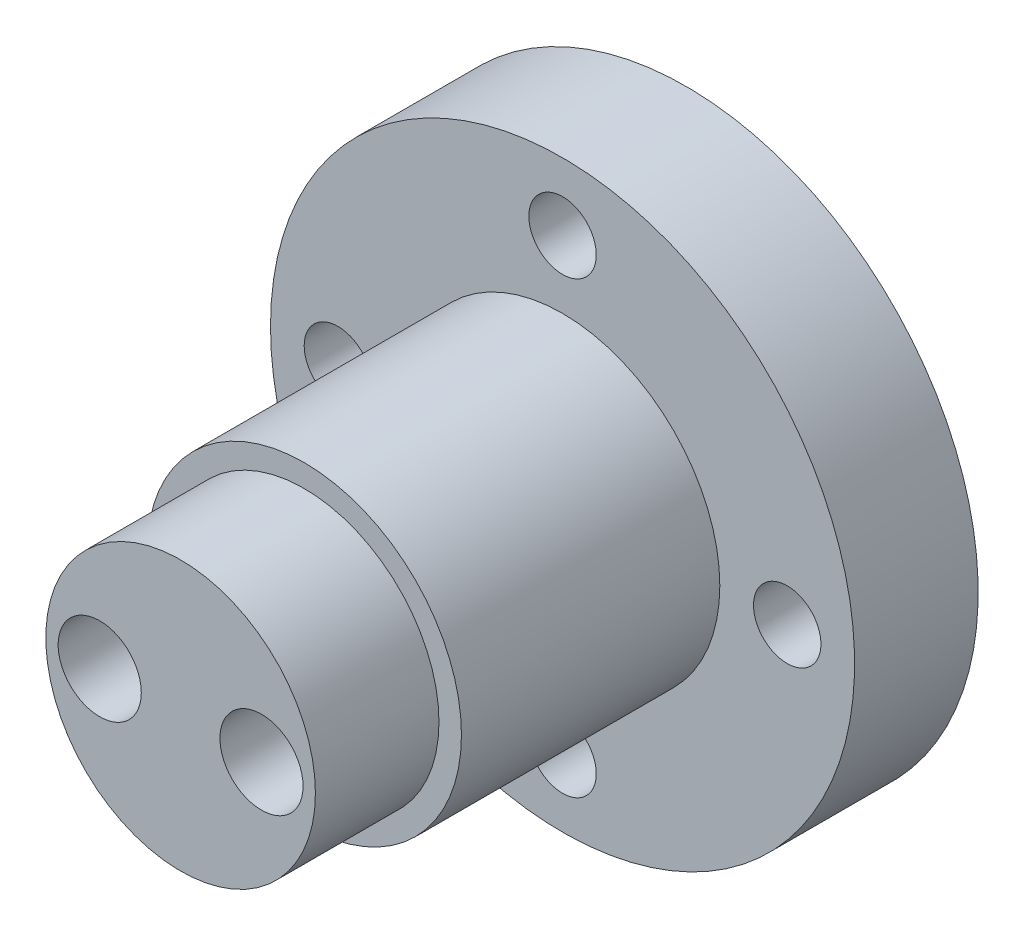
ISO-10303-21;
HEADER;
FILE_DESCRIPTION(('STEP AP214'),'2;1');
FILE_NAME('part.step','',(''),(''),'','','');
FILE_SCHEMA(('AUTOMOTIVE_DESIGN { 1 0 10303 214 1 1 1 1 }'));
ENDSEC;
DATA;
#1=APPLICATION_CONTEXT('core data for automotive mechanical design processes');
#2=APPLICATION_PROTOCOL_DEFINITION('international standard','automotive_design',2000,#1);
#3=PRODUCT_CONTEXT('',#1,'mechanical');
#4=PRODUCT('Part','Part','',(#3));
#5=PRODUCT_RELATED_PRODUCT_CATEGORY('part','',(#4));
#6=PRODUCT_DEFINITION_FORMATION('','',#4);
#7=PRODUCT_DEFINITION_CONTEXT('part definition',#1,'design');
#8=PRODUCT_DEFINITION('design','',#6,#7);
#9=PRODUCT_DEFINITION_SHAPE('','',#8);
#10=(LENGTH_UNIT() NAMED_UNIT(*) SI_UNIT(.MILLI.,.METRE.));
#11=(NAMED_UNIT(*) PLANE_ANGLE_UNIT() SI_UNIT($,.RADIAN.));
#12=(NAMED_UNIT(*) SI_UNIT($,.STERADIAN.) SOLID_ANGLE_UNIT());
#13=UNCERTAINTY_MEASURE_WITH_UNIT(LENGTH_MEASURE(1.E-05),#10,'distance_accuracy_value','');
#14=(GEOMETRIC_REPRESENTATION_CONTEXT(3) GLOBAL_UNCERTAINTY_ASSIGNED_CONTEXT((#13)) GLOBAL_UNIT_ASSIGNED_CONTEXT((#10,
#11,#12)) REPRESENTATION_CONTEXT('',''));
#15=CARTESIAN_POINT('',(0.,0.,0.));
#16=DIRECTION('',(0.,0.,1.));
#17=DIRECTION('',(1.,0.,0.));
#18=AXIS2_PLACEMENT_3D('',#15,#16,#17);
#19=CARTESIAN_POINT('',(0.,0.,11.5));
#20=DIRECTION('',(0.,0.,-1.));
#21=DIRECTION('',(-1.,0.,0.));
#22=AXIS2_PLACEMENT_3D('',#19,#20,#21);
#23=CYLINDRICAL_SURFACE('',#22,7.);
#24=CARTESIAN_POINT('',(0.,0.,11.5));
#25=DIRECTION('',(0.,0.,1.));
#26=DIRECTION('',(1.,0.,0.));
#27=AXIS2_PLACEMENT_3D('',#24,#25,#26);
#28=CIRCLE('',#27,7.);
#29=CARTESIAN_POINT('',(7.,0.,11.5));
#30=VERTEX_POINT('',#29);
#31=EDGE_CURVE('E37',#30,#30,#28,.T.);
#32=ORIENTED_EDGE('',*,*,#31,.F.);
#33=EDGE_LOOP('',(#32));
#34=FACE_BOUND('',#33,.T.);
#35=CARTESIAN_POINT('',(0.,0.,0.));
#36=DIRECTION('',(0.,0.,1.));
#37=DIRECTION('',(1.,0.,0.));
#38=AXIS2_PLACEMENT_3D('',#35,#36,#37);
#39=CIRCLE('',#38,7.);
#40=CARTESIAN_POINT('',(7.,0.,0.));
#41=VERTEX_POINT('',#40);
#42=EDGE_CURVE('E33',#41,#41,#39,.T.);
#43=ORIENTED_EDGE('',*,*,#42,.T.);
#44=EDGE_LOOP('',(#43));
#45=FACE_BOUND('',#44,.T.);
#46=ADVANCED_FACE('F30',(#34,#45),#23,.T.);
#47=CARTESIAN_POINT('',(0.,0.,11.5));
#48=DIRECTION('',(0.,0.,1.));
#49=DIRECTION('',(1.,0.,0.));
#50=AXIS2_PLACEMENT_3D('',#47,#48,#49);
#51=PLANE('',#50);
#52=CARTESIAN_POINT('',(0.,0.,11.5));
#53=DIRECTION('',(0.,0.,1.));
#54=DIRECTION('',(1.,0.,0.));
#55=AXIS2_PLACEMENT_3D('',#52,#53,#54);
#56=CIRCLE('',#55,6.);
#57=CARTESIAN_POINT('',(6.,0.,11.5));
#58=VERTEX_POINT('',#57);
#59=EDGE_CURVE('E10',#58,#58,#56,.T.);
#60=ORIENTED_EDGE('',*,*,#59,.F.);
#61=EDGE_LOOP('',(#60));
#62=FACE_BOUND('',#61,.T.);
#63=ORIENTED_EDGE('',*,*,#31,.T.);
#64=EDGE_LOOP('',(#63));
#65=FACE_BOUND('',#64,.T.);
#66=ADVANCED_FACE('F109',(#62,#65),#51,.T.);
#67=CARTESIAN_POINT('',(0.,0.,17.));
#68=DIRECTION('',(0.,0.,-1.));
#69=DIRECTION('',(-1.,0.,0.));
#70=AXIS2_PLACEMENT_3D('',#67,#68,#69);
#71=CYLINDRICAL_SURFACE('',#70,6.);
#72=CARTESIAN_POINT('',(0.,0.,17.));
#73=DIRECTION('',(0.,0.,1.));
#74=DIRECTION('',(1.,0.,0.));
#75=AXIS2_PLACEMENT_3D('',#72,#73,#74);
#76=CIRCLE('',#75,6.);
#77=CARTESIAN_POINT('',(6.,0.,17.));
#78=VERTEX_POINT('',#77);
#79=EDGE_CURVE('E42',#78,#78,#76,.T.);
#80=ORIENTED_EDGE('',*,*,#79,.F.);
#81=EDGE_LOOP('',(#80));
#82=FACE_BOUND('',#81,.T.);
#83=ORIENTED_EDGE('',*,*,#59,.T.);
#84=EDGE_LOOP('',(#83));
#85=FACE_BOUND('',#84,.T.);
#86=ADVANCED_FACE('F102',(#82,#85),#71,.T.);
#87=CARTESIAN_POINT('',(0.,0.,17.));
#88=DIRECTION('',(0.,0.,1.));
#89=DIRECTION('',(1.,0.,0.));
#90=AXIS2_PLACEMENT_3D('',#87,#88,#89);
#91=PLANE('',#90);
#92=CARTESIAN_POINT('',(3.6,-3.04023440482249E-07,17.));
#93=DIRECTION('',(0.,0.,1.));
#94=DIRECTION('',(1.,0.,0.));
#95=AXIS2_PLACEMENT_3D('',#92,#93,#94);
#96=CIRCLE('',#95,1.85);
#97=CARTESIAN_POINT('',(5.45,-3.04023440482249E-07,17.));
#98=VERTEX_POINT('',#97);
#99=EDGE_CURVE('E83',#98,#98,#96,.T.);
#100=ORIENTED_EDGE('',*,*,#99,.F.);
#101=EDGE_LOOP('',(#100));
#102=FACE_BOUND('',#101,.T.);
#103=CARTESIAN_POINT('',(-3.6,0.,17.));
#104=DIRECTION('',(0.,0.,1.));
#105=DIRECTION('',(1.,0.,0.));
#106=AXIS2_PLACEMENT_3D('',#103,#104,#105);
#107=CIRCLE('',#106,1.85);
#108=CARTESIAN_POINT('',(-1.75,0.,17.));
#109=VERTEX_POINT('',#108);
#110=EDGE_CURVE('E77',#109,#109,#107,.T.);
#111=ORIENTED_EDGE('',*,*,#110,.F.);
#112=EDGE_LOOP('',(#111));
#113=FACE_BOUND('',#112,.T.);
#114=ORIENTED_EDGE('',*,*,#79,.T.);
#115=EDGE_LOOP('',(#114));
#116=FACE_BOUND('',#115,.T.);
#117=ADVANCED_FACE('F99',(#102,#113,#116),#91,.T.);
#118=CARTESIAN_POINT('',(0.,0.,-5.5));
#119=DIRECTION('',(0.,0.,-1.));
#120=DIRECTION('',(-1.,0.,0.));
#121=AXIS2_PLACEMENT_3D('',#118,#119,#120);
#122=PLANE('',#121);
#123=CARTESIAN_POINT('',(3.6,-3.04023440482249E-07,-5.5));
#124=DIRECTION('',(0.,0.,1.));
#125=DIRECTION('',(1.,0.,0.));
#126=AXIS2_PLACEMENT_3D('',#123,#124,#125);
#127=CIRCLE('',#126,1.85);
#128=CARTESIAN_POINT('',(5.45,-3.04023440482249E-07,-5.5));
#129=VERTEX_POINT('',#128);
#130=EDGE_CURVE('E74',#129,#129,#127,.T.);
#131=ORIENTED_EDGE('',*,*,#130,.T.);
#132=EDGE_LOOP('',(#131));
#133=FACE_BOUND('',#132,.T.);
#134=CARTESIAN_POINT('',(-3.6,0.,-5.5));
#135=DIRECTION('',(0.,0.,1.));
#136=DIRECTION('',(1.,0.,0.));
#137=AXIS2_PLACEMENT_3D('',#134,#135,#136);
#138=CIRCLE('',#137,1.85);
#139=CARTESIAN_POINT('',(-1.75,0.,-5.5));
#140=VERTEX_POINT('',#139);
#141=EDGE_CURVE('E80',#140,#140,#138,.T.);
#142=ORIENTED_EDGE('',*,*,#141,.T.);
#143=EDGE_LOOP('',(#142));
#144=FACE_BOUND('',#143,.T.);
#145=CARTESIAN_POINT('',(10.,0.,-5.5));
#146=DIRECTION('',(0.,0.,-1.));
#147=DIRECTION('',(-1.,0.,0.));
#148=AXIS2_PLACEMENT_3D('',#145,#146,#147);
#149=CIRCLE('',#148,1.5);
#150=CARTESIAN_POINT('',(8.5,0.,-5.5));
#151=VERTEX_POINT('',#150);
#152=EDGE_CURVE('E62',#151,#151,#149,.T.);
#153=ORIENTED_EDGE('',*,*,#152,.F.);
#154=EDGE_LOOP('',(#153));
#155=FACE_BOUND('',#154,.T.);
#156=CARTESIAN_POINT('',(-10.,0.,-5.5));
#157=DIRECTION('',(0.,0.,-1.));
#158=DIRECTION('',(-1.,0.,0.));
#159=AXIS2_PLACEMENT_3D('',#156,#157,#158);
#160=CIRCLE('',#159,1.5);
#161=CARTESIAN_POINT('',(-11.5,0.,-5.5));
#162=VERTEX_POINT('',#161);
#163=EDGE_CURVE('E50',#162,#162,#160,.T.);
#164=ORIENTED_EDGE('',*,*,#163,.F.);
#165=EDGE_LOOP('',(#164));
#166=FACE_BOUND('',#165,.T.);
#167=CARTESIAN_POINT('',(0.,0.,-5.5));
#168=DIRECTION('',(0.,0.,-1.));
#169=DIRECTION('',(-1.,0.,0.));
#170=AXIS2_PLACEMENT_3D('',#167,#168,#169);
#171=CIRCLE('',#170,13.);
#172=CARTESIAN_POINT('',(-13.,0.,-5.5));
#173=VERTEX_POINT('',#172);
#174=EDGE_CURVE('E49',#173,#173,#171,.T.);
#175=ORIENTED_EDGE('',*,*,#174,.T.);
#176=EDGE_LOOP('',(#175));
#177=FACE_BOUND('',#176,.T.);
#178=CARTESIAN_POINT('',(0.,-10.,-5.5));
#179=DIRECTION('',(0.,0.,-1.));
#180=DIRECTION('',(-1.,0.,0.));
#181=AXIS2_PLACEMENT_3D('',#178,#179,#180);
#182=CIRCLE('',#181,1.5);
#183=CARTESIAN_POINT('',(-1.5,-10.,-5.5));
#184=VERTEX_POINT('',#183);
#185=EDGE_CURVE('E56',#184,#184,#182,.T.);
#186=ORIENTED_EDGE('',*,*,#185,.F.);
#187=EDGE_LOOP('',(#186));
#188=FACE_BOUND('',#187,.T.);
#189=CARTESIAN_POINT('',(0.,10.,-5.5));
#190=DIRECTION('',(0.,0.,-1.));
#191=DIRECTION('',(-1.,0.,0.));
#192=AXIS2_PLACEMENT_3D('',#189,#190,#191);
#193=CIRCLE('',#192,1.5);
#194=CARTESIAN_POINT('',(-1.5,10.,-5.5));
#195=VERTEX_POINT('',#194);
#196=EDGE_CURVE('E68',#195,#195,#193,.T.);
#197=ORIENTED_EDGE('',*,*,#196,.F.);
#198=EDGE_LOOP('',(#197));
#199=FACE_BOUND('',#198,.T.);
#200=ADVANCED_FACE('F89',(#133,#144,#155,#166,#177,#188,#199),#122,.T.);
#201=CARTESIAN_POINT('',(0.,0.,0.));
#202=DIRECTION('',(0.,0.,-1.));
#203=DIRECTION('',(-1.,0.,0.));
#204=AXIS2_PLACEMENT_3D('',#201,#202,#203);
#205=PLANE('',#204);
#206=ORIENTED_EDGE('',*,*,#42,.F.);
#207=EDGE_LOOP('',(#206));
#208=FACE_BOUND('',#207,.T.);
#209=CARTESIAN_POINT('',(0.,0.,0.));
#210=DIRECTION('',(0.,0.,-1.));
#211=DIRECTION('',(-1.,0.,0.));
#212=AXIS2_PLACEMENT_3D('',#209,#210,#211);
#213=CIRCLE('',#212,13.);
#214=CARTESIAN_POINT('',(-13.,0.,0.));
#215=VERTEX_POINT('',#214);
#216=EDGE_CURVE('E46',#215,#215,#213,.T.);
#217=ORIENTED_EDGE('',*,*,#216,.F.);
#218=EDGE_LOOP('',(#217));
#219=FACE_BOUND('',#218,.T.);
#220=CARTESIAN_POINT('',(-10.,0.,0.));
#221=DIRECTION('',(0.,0.,-1.));
#222=DIRECTION('',(-1.,0.,0.));
#223=AXIS2_PLACEMENT_3D('',#220,#221,#222);
#224=CIRCLE('',#223,1.5);
#225=CARTESIAN_POINT('',(-11.5,0.,0.));
#226=VERTEX_POINT('',#225);
#227=EDGE_CURVE('E53',#226,#226,#224,.T.);
#228=ORIENTED_EDGE('',*,*,#227,.T.);
#229=EDGE_LOOP('',(#228));
#230=FACE_BOUND('',#229,.T.);
#231=CARTESIAN_POINT('',(0.,-10.,0.));
#232=DIRECTION('',(0.,0.,-1.));
#233=DIRECTION('',(-1.,0.,0.));
#234=AXIS2_PLACEMENT_3D('',#231,#232,#233);
#235=CIRCLE('',#234,1.5);
#236=CARTESIAN_POINT('',(-1.5,-10.,0.));
#237=VERTEX_POINT('',#236);
#238=EDGE_CURVE('E59',#237,#237,#235,.T.);
#239=ORIENTED_EDGE('',*,*,#238,.T.);
#240=EDGE_LOOP('',(#239));
#241=FACE_BOUND('',#240,.T.);
#242=CARTESIAN_POINT('',(10.,0.,0.));
#243=DIRECTION('',(0.,0.,-1.));
#244=DIRECTION('',(-1.,0.,0.));
#245=AXIS2_PLACEMENT_3D('',#242,#243,#244);
#246=CIRCLE('',#245,1.5);
#247=CARTESIAN_POINT('',(8.5,0.,0.));
#248=VERTEX_POINT('',#247);
#249=EDGE_CURVE('E65',#248,#248,#246,.T.);
#250=ORIENTED_EDGE('',*,*,#249,.T.);
#251=EDGE_LOOP('',(#250));
#252=FACE_BOUND('',#251,.T.);
#253=CARTESIAN_POINT('',(0.,10.,0.));
#254=DIRECTION('',(0.,0.,-1.));
#255=DIRECTION('',(-1.,0.,0.));
#256=AXIS2_PLACEMENT_3D('',#253,#254,#255);
#257=CIRCLE('',#256,1.5);
#258=CARTESIAN_POINT('',(-1.5,10.,0.));
#259=VERTEX_POINT('',#258);
#260=EDGE_CURVE('E71',#259,#259,#257,.T.);
#261=ORIENTED_EDGE('',*,*,#260,.T.);
#262=EDGE_LOOP('',(#261));
#263=FACE_BOUND('',#262,.T.);
#264=ADVANCED_FACE('F124',(#208,#219,#230,#241,#252,#263),#205,.F.);
#265=CARTESIAN_POINT('',(0.,0.,-5.5));
#266=DIRECTION('',(0.,0.,1.));
#267=DIRECTION('',(1.,0.,0.));
#268=AXIS2_PLACEMENT_3D('',#265,#266,#267);
#269=CYLINDRICAL_SURFACE('',#268,13.);
#270=ORIENTED_EDGE('',*,*,#174,.F.);
#271=EDGE_LOOP('',(#270));
#272=FACE_BOUND('',#271,.T.);
#273=ORIENTED_EDGE('',*,*,#216,.T.);
#274=EDGE_LOOP('',(#273));
#275=FACE_BOUND('',#274,.T.);
#276=ADVANCED_FACE('F127',(#272,#275),#269,.T.);
#277=CARTESIAN_POINT('',(-10.,0.,-5.5));
#278=DIRECTION('',(0.,0.,1.));
#279=DIRECTION('',(1.,0.,0.));
#280=AXIS2_PLACEMENT_3D('',#277,#278,#279);
#281=CYLINDRICAL_SURFACE('',#280,1.5);
#282=ORIENTED_EDGE('',*,*,#163,.T.);
#283=EDGE_LOOP('',(#282));
#284=FACE_BOUND('',#283,.T.);
#285=ORIENTED_EDGE('',*,*,#227,.F.);
#286=EDGE_LOOP('',(#285));
#287=FACE_BOUND('',#286,.T.);
#288=ADVANCED_FACE('F156',(#284,#287),#281,.F.);
#289=CARTESIAN_POINT('',(0.,-10.,-5.5));
#290=DIRECTION('',(0.,0.,1.));
#291=DIRECTION('',(1.,0.,0.));
#292=AXIS2_PLACEMENT_3D('',#289,#290,#291);
#293=CYLINDRICAL_SURFACE('',#292,1.5);
#294=ORIENTED_EDGE('',*,*,#185,.T.);
#295=EDGE_LOOP('',(#294));
#296=FACE_BOUND('',#295,.T.);
#297=ORIENTED_EDGE('',*,*,#238,.F.);
#298=EDGE_LOOP('',(#297));
#299=FACE_BOUND('',#298,.T.);
#300=ADVANCED_FACE('F150',(#296,#299),#293,.F.);
#301=CARTESIAN_POINT('',(10.,0.,-5.5));
#302=DIRECTION('',(0.,0.,1.));
#303=DIRECTION('',(1.,0.,0.));
#304=AXIS2_PLACEMENT_3D('',#301,#302,#303);
#305=CYLINDRICAL_SURFACE('',#304,1.5);
#306=ORIENTED_EDGE('',*,*,#152,.T.);
#307=EDGE_LOOP('',(#306));
#308=FACE_BOUND('',#307,.T.);
#309=ORIENTED_EDGE('',*,*,#249,.F.);
#310=EDGE_LOOP('',(#309));
#311=FACE_BOUND('',#310,.T.);
#312=ADVANCED_FACE('F141',(#308,#311),#305,.F.);
#313=CARTESIAN_POINT('',(0.,10.,-5.5));
#314=DIRECTION('',(0.,0.,1.));
#315=DIRECTION('',(1.,0.,0.));
#316=AXIS2_PLACEMENT_3D('',#313,#314,#315);
#317=CYLINDRICAL_SURFACE('',#316,1.5);
#318=ORIENTED_EDGE('',*,*,#196,.T.);
#319=EDGE_LOOP('',(#318));
#320=FACE_BOUND('',#319,.T.);
#321=ORIENTED_EDGE('',*,*,#260,.F.);
#322=EDGE_LOOP('',(#321));
#323=FACE_BOUND('',#322,.T.);
#324=ADVANCED_FACE('F139',(#320,#323),#317,.F.);
#325=CARTESIAN_POINT('',(-3.6,0.,-5.5));
#326=DIRECTION('',(0.,0.,1.));
#327=DIRECTION('',(1.,0.,0.));
#328=AXIS2_PLACEMENT_3D('',#325,#326,#327);
#329=CYLINDRICAL_SURFACE('',#328,1.85);
#330=CARTESIAN_POINT('',(-1.75,0.,-5.5));
#331=CARTESIAN_POINT('',(-1.75,0.,-5.265625));
#332=CARTESIAN_POINT('',(-1.75,0.,-5.03125));
#333=CARTESIAN_POINT('',(-1.75,0.,-4.5625));
#334=CARTESIAN_POINT('',(-1.75,0.,-4.328125));
#335=CARTESIAN_POINT('',(-1.75,0.,-3.859375));
#336=CARTESIAN_POINT('',(-1.75,0.,-3.625));
#337=CARTESIAN_POINT('',(-1.75,0.,-3.15625));
#338=CARTESIAN_POINT('',(-1.75,0.,-2.921875));
#339=CARTESIAN_POINT('',(-1.75,0.,-2.453125));
#340=CARTESIAN_POINT('',(-1.75,0.,-2.21875));
#341=CARTESIAN_POINT('',(-1.75,0.,-1.75));
#342=CARTESIAN_POINT('',(-1.75,0.,-1.515625));
#343=CARTESIAN_POINT('',(-1.75,0.,-1.046875));
#344=CARTESIAN_POINT('',(-1.75,0.,-0.812499999999999));
#345=CARTESIAN_POINT('',(-1.75,0.,-0.343749999999999));
#346=CARTESIAN_POINT('',(-1.75,0.,-0.109374999999999));
#347=CARTESIAN_POINT('',(-1.75,0.,0.359375000000001));
#348=CARTESIAN_POINT('',(-1.75,0.,0.593750000000001));
#349=CARTESIAN_POINT('',(-1.75,0.,1.0625));
#350=CARTESIAN_POINT('',(-1.75,0.,1.296875));
#351=CARTESIAN_POINT('',(-1.75,0.,1.765625));
#352=CARTESIAN_POINT('',(-1.75,0.,2.));
#353=CARTESIAN_POINT('',(-1.75,0.,2.46875));
#354=CARTESIAN_POINT('',(-1.75,0.,2.703125));
#355=CARTESIAN_POINT('',(-1.75,0.,3.171875));
#356=CARTESIAN_POINT('',(-1.75,0.,3.40625));
#357=CARTESIAN_POINT('',(-1.75,0.,3.875));
#358=CARTESIAN_POINT('',(-1.75,0.,4.109375));
#359=CARTESIAN_POINT('',(-1.75,0.,4.578125));
#360=CARTESIAN_POINT('',(-1.75,0.,4.8125));
#361=CARTESIAN_POINT('',(-1.75,0.,5.28125));
#362=CARTESIAN_POINT('',(-1.75,0.,5.515625));
#363=CARTESIAN_POINT('',(-1.75,0.,5.984375));
#364=CARTESIAN_POINT('',(-1.75,0.,6.21875));
#365=CARTESIAN_POINT('',(-1.75,0.,6.6875));
#366=CARTESIAN_POINT('',(-1.75,0.,6.921875));
#367=CARTESIAN_POINT('',(-1.75,0.,7.390625));
#368=CARTESIAN_POINT('',(-1.75,0.,7.625));
#369=CARTESIAN_POINT('',(-1.75,0.,8.09375));
#370=CARTESIAN_POINT('',(-1.75,0.,8.328125));
#371=CARTESIAN_POINT('',(-1.75,0.,8.796875));
#372=CARTESIAN_POINT('',(-1.75,0.,9.03125));
#373=CARTESIAN_POINT('',(-1.75,0.,9.5));
#374=CARTESIAN_POINT('',(-1.75,0.,9.734375));
#375=CARTESIAN_POINT('',(-1.75,0.,10.203125));
#376=CARTESIAN_POINT('',(-1.75,0.,10.4375));
#377=CARTESIAN_POINT('',(-1.75,0.,10.90625));
#378=CARTESIAN_POINT('',(-1.75,0.,11.140625));
#379=CARTESIAN_POINT('',(-1.75,0.,11.609375));
#380=CARTESIAN_POINT('',(-1.75,0.,11.84375));
#381=CARTESIAN_POINT('',(-1.75,0.,12.3125));
#382=CARTESIAN_POINT('',(-1.75,0.,12.546875));
#383=CARTESIAN_POINT('',(-1.75,0.,13.015625));
#384=CARTESIAN_POINT('',(-1.75,0.,13.25));
#385=CARTESIAN_POINT('',(-1.75,0.,13.71875));
#386=CARTESIAN_POINT('',(-1.75,0.,13.953125));
#387=CARTESIAN_POINT('',(-1.75,0.,14.421875));
#388=CARTESIAN_POINT('',(-1.75,0.,14.65625));
#389=CARTESIAN_POINT('',(-1.75,0.,15.125));
#390=CARTESIAN_POINT('',(-1.75,0.,15.359375));
#391=CARTESIAN_POINT('',(-1.75,0.,15.828125));
#392=CARTESIAN_POINT('',(-1.75,0.,16.0625));
#393=CARTESIAN_POINT('',(-1.75,0.,16.53125));
#394=CARTESIAN_POINT('',(-1.75,0.,16.765625));
#395=CARTESIAN_POINT('',(-1.75,0.,17.));
#396=B_SPLINE_CURVE_WITH_KNOTS('',3,(#330,#331,#332,#333,#334,#335,#336,#337,#338,#339,#340,
#341,#342,#343,#344,#345,#346,#347,#348,#349,#350,#351,#352,#353,#354,#355,#356,#357,#358,#359,
#360,#361,#362,#363,#364,#365,#366,#367,#368,#369,#370,#371,#372,#373,#374,#375,#376,#377,#378,
#379,#380,#381,#382,#383,#384,#385,#386,#387,#388,#389,#390,#391,#392,#393,#394,#395),
.UNSPECIFIED.,.F.,.F.,(4,2,2,2,2,2,2,2,2,2,2,2,2,2,2,2,2,2,2,2,2,2,2,2,2,2,2,2,2,2,2,2,4),(0.,
0.703125,1.40625,2.109375,2.8125,3.515625,4.21875,4.921875,5.625,6.328125,7.03125,7.734375,
8.4375,9.140625,9.84375,10.546875,11.25,11.953125,12.65625,13.359375,14.0625,14.765625,15.46875,
16.171875,16.875,17.578125,18.28125,18.984375,19.6875,20.390625,21.09375,21.796875,22.5),.UNSPECIFIED.);
#397=EDGE_CURVE('BSEAM95',#140,#109,#396,.T.);
#398=ORIENTED_EDGE('',*,*,#141,.F.);
#399=ORIENTED_EDGE('',*,*,#110,.T.);
#400=ORIENTED_EDGE('',*,*,#397,.T.);
#401=ORIENTED_EDGE('',*,*,#397,.F.);
#402=EDGE_LOOP('',(#398,#400,#399,#401));
#403=FACE_BOUND('',#402,.T.);
#404=ADVANCED_FACE('F95',(#403),#329,.F.);
#405=CARTESIAN_POINT('',(3.6,-3.04023440482249E-07,-5.5));
#406=DIRECTION('',(0.,0.,1.));
#407=DIRECTION('',(1.,0.,0.));
#408=AXIS2_PLACEMENT_3D('',#405,#406,#407);
#409=CYLINDRICAL_SURFACE('',#408,1.85);
#410=CARTESIAN_POINT('',(5.45,-3.04023440482249E-07,-5.5));
#411=CARTESIAN_POINT('',(5.45,-3.04023440482249E-07,-5.265625));
#412=CARTESIAN_POINT('',(5.45,-3.04023440482249E-07,-5.03125));
#413=CARTESIAN_POINT('',(5.45,-3.04023440482249E-07,-4.5625));
#414=CARTESIAN_POINT('',(5.45,-3.04023440482249E-07,-4.328125));
#415=CARTESIAN_POINT('',(5.45,-3.04023440482249E-07,-3.859375));
#416=CARTESIAN_POINT('',(5.45,-3.04023440482249E-07,-3.625));
#417=CARTESIAN_POINT('',(5.45,-3.04023440482249E-07,-3.15625));
#418=CARTESIAN_POINT('',(5.45,-3.04023440482249E-07,-2.921875));
#419=CARTESIAN_POINT('',(5.45,-3.04023440482249E-07,-2.453125));
#420=CARTESIAN_POINT('',(5.45,-3.04023440482249E-07,-2.21875));
#421=CARTESIAN_POINT('',(5.45,-3.04023440482249E-07,-1.75));
#422=CARTESIAN_POINT('',(5.45,-3.04023440482249E-07,-1.515625));
#423=CARTESIAN_POINT('',(5.45,-3.04023440482249E-07,-1.046875));
#424=CARTESIAN_POINT('',(5.45,-3.04023440482249E-07,-0.812499999999999));
#425=CARTESIAN_POINT('',(5.45,-3.04023440482249E-07,-0.343749999999999));
#426=CARTESIAN_POINT('',(5.45,-3.04023440482249E-07,-0.109374999999999));
#427=CARTESIAN_POINT('',(5.45,-3.04023440482249E-07,0.359375000000001));
#428=CARTESIAN_POINT('',(5.45,-3.04023440482249E-07,0.593750000000001));
#429=CARTESIAN_POINT('',(5.45,-3.04023440482249E-07,1.0625));
#430=CARTESIAN_POINT('',(5.45,-3.04023440482249E-07,1.296875));
#431=CARTESIAN_POINT('',(5.45,-3.04023440482249E-07,1.765625));
#432=CARTESIAN_POINT('',(5.45,-3.04023440482249E-07,2.));
#433=CARTESIAN_POINT('',(5.45,-3.04023440482249E-07,2.46875));
#434=CARTESIAN_POINT('',(5.45,-3.04023440482249E-07,2.703125));
#435=CARTESIAN_POINT('',(5.45,-3.04023440482249E-07,3.171875));
#436=CARTESIAN_POINT('',(5.45,-3.04023440482249E-07,3.40625));
#437=CARTESIAN_POINT('',(5.45,-3.04023440482249E-07,3.875));
#438=CARTESIAN_POINT('',(5.45,-3.04023440482249E-07,4.109375));
#439=CARTESIAN_POINT('',(5.45,-3.04023440482249E-07,4.578125));
#440=CARTESIAN_POINT('',(5.45,-3.04023440482249E-07,4.8125));
#441=CARTESIAN_POINT('',(5.45,-3.04023440482249E-07,5.28125));
#442=CARTESIAN_POINT('',(5.45,-3.04023440482249E-07,5.515625));
#443=CARTESIAN_POINT('',(5.45,-3.04023440482249E-07,5.984375));
#444=CARTESIAN_POINT('',(5.45,-3.04023440482249E-07,6.21875));
#445=CARTESIAN_POINT('',(5.45,-3.04023440482249E-07,6.6875));
#446=CARTESIAN_POINT('',(5.45,-3.04023440482249E-07,6.921875));
#447=CARTESIAN_POINT('',(5.45,-3.04023440482249E-07,7.390625));
#448=CARTESIAN_POINT('',(5.45,-3.04023440482249E-07,7.625));
#449=CARTESIAN_POINT('',(5.45,-3.04023440482249E-07,8.09375));
#450=CARTESIAN_POINT('',(5.45,-3.04023440482249E-07,8.328125));
#451=CARTESIAN_POINT('',(5.45,-3.04023440482249E-07,8.796875));
#452=CARTESIAN_POINT('',(5.45,-3.04023440482249E-07,9.03125));
#453=CARTESIAN_POINT('',(5.45,-3.04023440482249E-07,9.5));
#454=CARTESIAN_POINT('',(5.45,-3.04023440482249E-07,9.734375));
#455=CARTESIAN_POINT('',(5.45,-3.04023440482249E-07,10.203125));
#456=CARTESIAN_POINT('',(5.45,-3.04023440482249E-07,10.4375));
#457=CARTESIAN_POINT('',(5.45,-3.04023440482249E-07,10.90625));
#458=CARTESIAN_POINT('',(5.45,-3.04023440482249E-07,11.140625));
#459=CARTESIAN_POINT('',(5.45,-3.04023440482249E-07,11.609375));
#460=CARTESIAN_POINT('',(5.45,-3.04023440482249E-07,11.84375));
#461=CARTESIAN_POINT('',(5.45,-3.04023440482249E-07,12.3125));
#462=CARTESIAN_POINT('',(5.45,-3.04023440482249E-07,12.546875));
#463=CARTESIAN_POINT('',(5.45,-3.04023440482249E-07,13.015625));
#464=CARTESIAN_POINT('',(5.45,-3.04023440482249E-07,13.25));
#465=CARTESIAN_POINT('',(5.45,-3.04023440482249E-07,13.71875));
#466=CARTESIAN_POINT('',(5.45,-3.04023440482249E-07,13.953125));
#467=CARTESIAN_POINT('',(5.45,-3.04023440482249E-07,14.421875));
#468=CARTESIAN_POINT('',(5.45,-3.04023440482249E-07,14.65625));
#469=CARTESIAN_POINT('',(5.45,-3.04023440482249E-07,15.125));
#470=CARTESIAN_POINT('',(5.45,-3.04023440482249E-07,15.359375));
#471=CARTESIAN_POINT('',(5.45,-3.04023440482249E-07,15.828125));
#472=CARTESIAN_POINT('',(5.45,-3.04023440482249E-07,16.0625));
#473=CARTESIAN_POINT('',(5.45,-3.04023440482249E-07,16.53125));
#474=CARTESIAN_POINT('',(5.45,-3.04023440482249E-07,16.765625));
#475=CARTESIAN_POINT('',(5.45,-3.04023440482249E-07,17.));
#476=B_SPLINE_CURVE_WITH_KNOTS('',3,(#410,#411,#412,#413,#414,#415,#416,#417,#418,#419,#420,
#421,#422,#423,#424,#425,#426,#427,#428,#429,#430,#431,#432,#433,#434,#435,#436,#437,#438,#439,
#440,#441,#442,#443,#444,#445,#446,#447,#448,#449,#450,#451,#452,#453,#454,#455,#456,#457,#458,
#459,#460,#461,#462,#463,#464,#465,#466,#467,#468,#469,#470,#471,#472,#473,#474,#475),
.UNSPECIFIED.,.F.,.F.,(4,2,2,2,2,2,2,2,2,2,2,2,2,2,2,2,2,2,2,2,2,2,2,2,2,2,2,2,2,2,2,2,4),(0.,
0.703125,1.40625,2.109375,2.8125,3.515625,4.21875,4.921875,5.625,6.328125,7.03125,7.734375,
8.4375,9.140625,9.84375,10.546875,11.25,11.953125,12.65625,13.359375,14.0625,14.765625,15.46875,
16.171875,16.875,17.578125,18.28125,18.984375,19.6875,20.390625,21.09375,21.796875,22.5),.UNSPECIFIED.);
#477=EDGE_CURVE('BSEAM92',#129,#98,#476,.T.);
#478=ORIENTED_EDGE('',*,*,#130,.F.);
#479=ORIENTED_EDGE('',*,*,#99,.T.);
#480=ORIENTED_EDGE('',*,*,#477,.T.);
#481=ORIENTED_EDGE('',*,*,#477,.F.);
#482=EDGE_LOOP('',(#478,#480,#479,#481));
#483=FACE_BOUND('',#482,.T.);
#484=ADVANCED_FACE('F92',(#483),#409,.F.);
#485=CLOSED_SHELL('',(#46,#66,#86,#117,#200,#264,#276,#288,#300,#312,#324,#404,#484));
#486=MANIFOLD_SOLID_BREP('B2',#485);
#487=ADVANCED_BREP_SHAPE_REPRESENTATION('',(#18,#486),#14);
#488=SHAPE_DEFINITION_REPRESENTATION(#9,#487);
ENDSEC;
END-ISO-10303-21;
